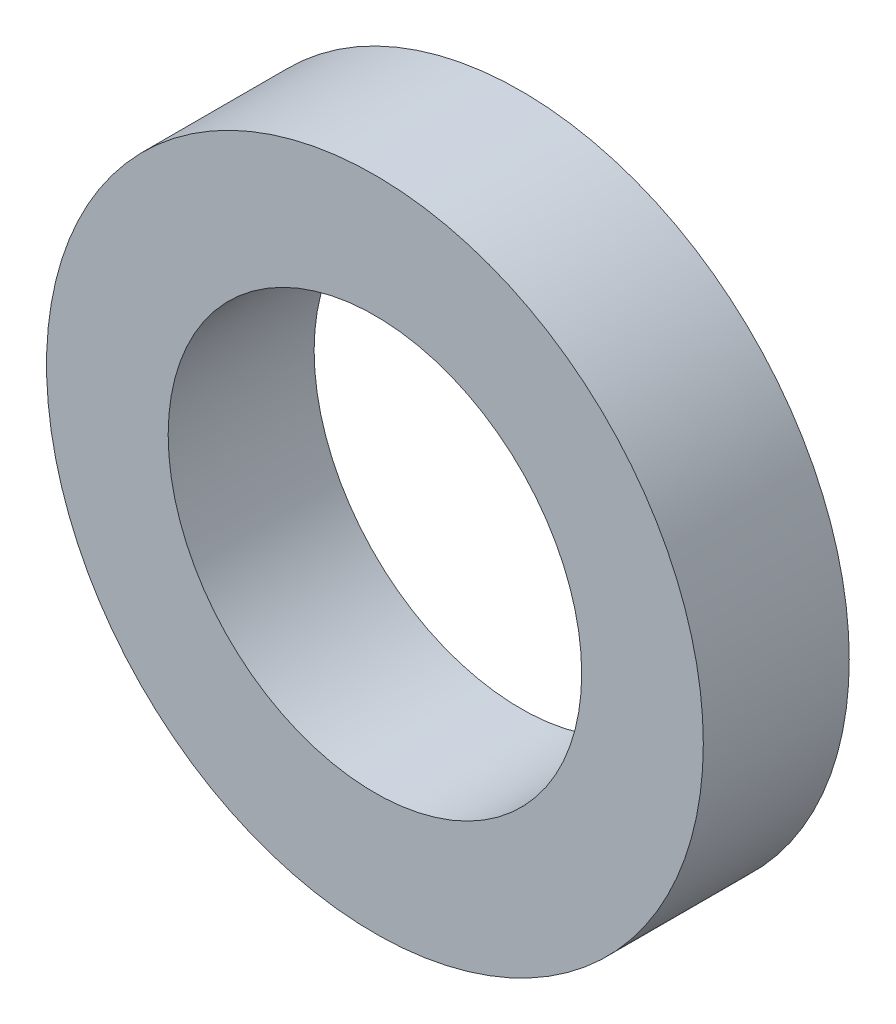
ISO-10303-21;
HEADER;
FILE_DESCRIPTION(('STEP AP214'),'2;1');
FILE_NAME('part.step','',(''),(''),'','','');
FILE_SCHEMA(('AUTOMOTIVE_DESIGN { 1 0 10303 214 1 1 1 1 }'));
ENDSEC;
DATA;
#1=APPLICATION_CONTEXT('core data for automotive mechanical design processes');
#2=APPLICATION_PROTOCOL_DEFINITION('international standard','automotive_design',2000,#1);
#3=PRODUCT_CONTEXT('',#1,'mechanical');
#4=PRODUCT('Part','Part','',(#3));
#5=PRODUCT_RELATED_PRODUCT_CATEGORY('part','',(#4));
#6=PRODUCT_DEFINITION_FORMATION('','',#4);
#7=PRODUCT_DEFINITION_CONTEXT('part definition',#1,'design');
#8=PRODUCT_DEFINITION('design','',#6,#7);
#9=PRODUCT_DEFINITION_SHAPE('','',#8);
#10=(LENGTH_UNIT() NAMED_UNIT(*) SI_UNIT(.MILLI.,.METRE.));
#11=(NAMED_UNIT(*) PLANE_ANGLE_UNIT() SI_UNIT($,.RADIAN.));
#12=(NAMED_UNIT(*) SI_UNIT($,.STERADIAN.) SOLID_ANGLE_UNIT());
#13=UNCERTAINTY_MEASURE_WITH_UNIT(LENGTH_MEASURE(1.E-05),#10,'distance_accuracy_value','');
#14=(GEOMETRIC_REPRESENTATION_CONTEXT(3) GLOBAL_UNCERTAINTY_ASSIGNED_CONTEXT((#13)) GLOBAL_UNIT_ASSIGNED_CONTEXT((#10,
#11,#12)) REPRESENTATION_CONTEXT('',''));
#15=CARTESIAN_POINT('',(0.,0.,0.));
#16=DIRECTION('',(0.,0.,1.));
#17=DIRECTION('',(1.,0.,0.));
#18=AXIS2_PLACEMENT_3D('',#15,#16,#17);
#19=CARTESIAN_POINT('',(0.,0.,3.));
#20=DIRECTION('',(0.,0.,1.));
#21=DIRECTION('',(1.,0.,0.));
#22=AXIS2_PLACEMENT_3D('',#19,#20,#21);
#23=PLANE('',#22);
#24=CARTESIAN_POINT('',(0.,0.,3.));
#25=DIRECTION('',(0.,0.,1.));
#26=DIRECTION('',(1.,0.,0.));
#27=AXIS2_PLACEMENT_3D('',#24,#25,#26);
#28=CIRCLE('',#27,6.75);
#29=CARTESIAN_POINT('',(6.75,0.,3.));
#30=VERTEX_POINT('',#29);
#31=EDGE_CURVE('E10',#30,#30,#28,.T.);
#32=ORIENTED_EDGE('',*,*,#31,.T.);
#33=EDGE_LOOP('',(#32));
#34=FACE_BOUND('',#33,.T.);
#35=CARTESIAN_POINT('',(0.,0.,3.));
#36=DIRECTION('',(0.,0.,1.));
#37=DIRECTION('',(1.,0.,0.));
#38=AXIS2_PLACEMENT_3D('',#35,#36,#37);
#39=CIRCLE('',#38,4.25);
#40=CARTESIAN_POINT('',(4.25,0.,3.));
#41=VERTEX_POINT('',#40);
#42=EDGE_CURVE('E43',#41,#41,#39,.T.);
#43=ORIENTED_EDGE('',*,*,#42,.F.);
#44=EDGE_LOOP('',(#43));
#45=FACE_BOUND('',#44,.T.);
#46=ADVANCED_FACE('F32',(#34,#45),#23,.T.);
#47=CARTESIAN_POINT('',(0.,0.,0.));
#48=DIRECTION('',(0.,0.,1.));
#49=DIRECTION('',(1.,0.,0.));
#50=AXIS2_PLACEMENT_3D('',#47,#48,#49);
#51=PLANE('',#50);
#52=CARTESIAN_POINT('',(0.,0.,0.));
#53=DIRECTION('',(0.,0.,1.));
#54=DIRECTION('',(1.,0.,0.));
#55=AXIS2_PLACEMENT_3D('',#52,#53,#54);
#56=CIRCLE('',#55,6.75);
#57=CARTESIAN_POINT('',(6.75,0.,0.));
#58=VERTEX_POINT('',#57);
#59=EDGE_CURVE('E36',#58,#58,#56,.T.);
#60=ORIENTED_EDGE('',*,*,#59,.F.);
#61=EDGE_LOOP('',(#60));
#62=FACE_BOUND('',#61,.T.);
#63=CARTESIAN_POINT('',(0.,0.,0.));
#64=DIRECTION('',(0.,0.,1.));
#65=DIRECTION('',(1.,0.,0.));
#66=AXIS2_PLACEMENT_3D('',#63,#64,#65);
#67=CIRCLE('',#66,4.25);
#68=CARTESIAN_POINT('',(4.25,0.,0.));
#69=VERTEX_POINT('',#68);
#70=EDGE_CURVE('E45',#69,#69,#67,.T.);
#71=ORIENTED_EDGE('',*,*,#70,.T.);
#72=EDGE_LOOP('',(#71));
#73=FACE_BOUND('',#72,.T.);
#74=ADVANCED_FACE('F55',(#62,#73),#51,.F.);
#75=CARTESIAN_POINT('',(0.,0.,3.));
#76=DIRECTION('',(0.,0.,-1.));
#77=DIRECTION('',(-1.,0.,0.));
#78=AXIS2_PLACEMENT_3D('',#75,#76,#77);
#79=CYLINDRICAL_SURFACE('',#78,6.75);
#80=ORIENTED_EDGE('',*,*,#31,.F.);
#81=EDGE_LOOP('',(#80));
#82=FACE_BOUND('',#81,.T.);
#83=ORIENTED_EDGE('',*,*,#59,.T.);
#84=EDGE_LOOP('',(#83));
#85=FACE_BOUND('',#84,.T.);
#86=ADVANCED_FACE('F34',(#82,#85),#79,.T.);
#87=CARTESIAN_POINT('',(0.,0.,3.));
#88=DIRECTION('',(0.,0.,-1.));
#89=DIRECTION('',(-1.,0.,0.));
#90=AXIS2_PLACEMENT_3D('',#87,#88,#89);
#91=CYLINDRICAL_SURFACE('',#90,4.25);
#92=ORIENTED_EDGE('',*,*,#42,.T.);
#93=EDGE_LOOP('',(#92));
#94=FACE_BOUND('',#93,.T.);
#95=ORIENTED_EDGE('',*,*,#70,.F.);
#96=EDGE_LOOP('',(#95));
#97=FACE_BOUND('',#96,.T.);
#98=ADVANCED_FACE('F51',(#94,#97),#91,.F.);
#99=CLOSED_SHELL('',(#46,#74,#86,#98));
#100=MANIFOLD_SOLID_BREP('B2',#99);
#101=ADVANCED_BREP_SHAPE_REPRESENTATION('',(#18,#100),#14);
#102=SHAPE_DEFINITION_REPRESENTATION(#9,#101);
ENDSEC;
END-ISO-10303-21;
